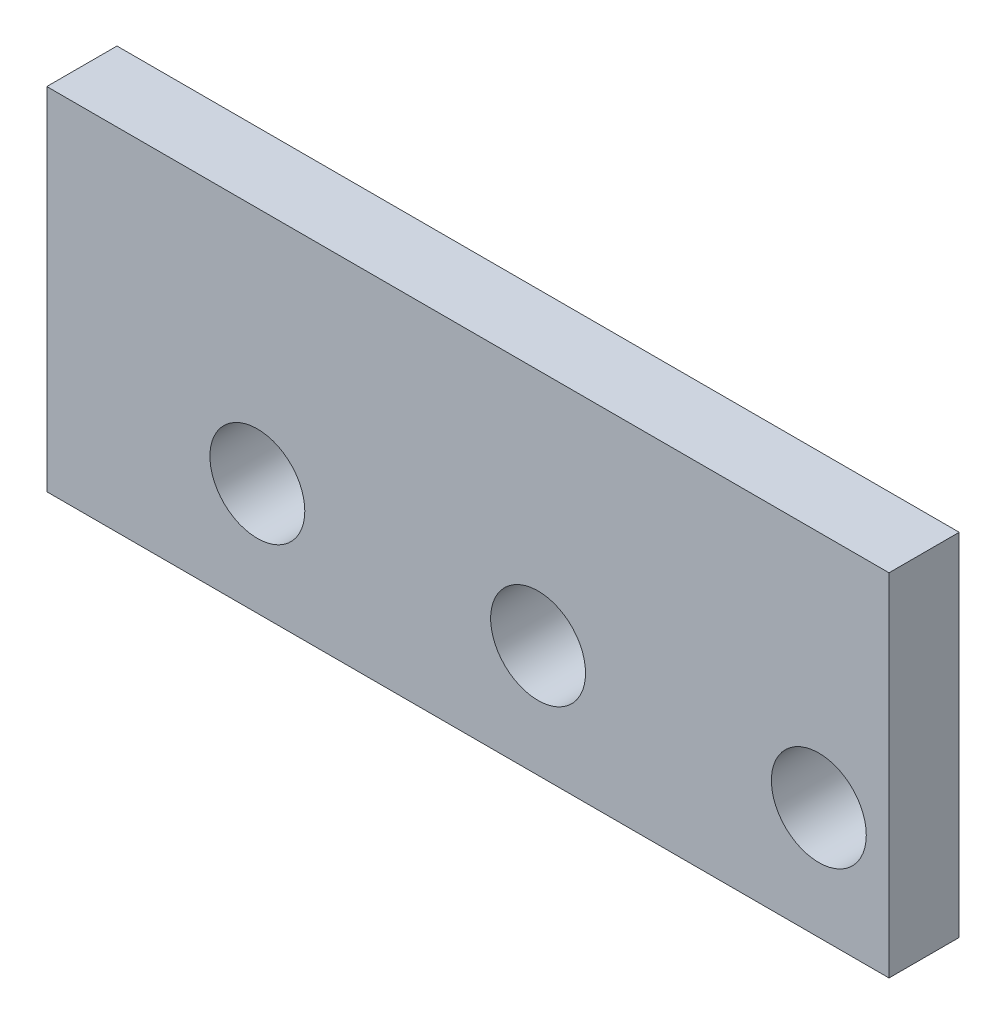
ISO-10303-21;
HEADER;
FILE_DESCRIPTION(('STEP AP214'),'2;1');
FILE_NAME('part.step','',(''),(''),'','','');
FILE_SCHEMA(('AUTOMOTIVE_DESIGN { 1 0 10303 214 1 1 1 1 }'));
ENDSEC;
DATA;
#1=APPLICATION_CONTEXT('core data for automotive mechanical design processes');
#2=APPLICATION_PROTOCOL_DEFINITION('international standard','automotive_design',2000,#1);
#3=PRODUCT_CONTEXT('',#1,'mechanical');
#4=PRODUCT('Part','Part','',(#3));
#5=PRODUCT_RELATED_PRODUCT_CATEGORY('part','',(#4));
#6=PRODUCT_DEFINITION_FORMATION('','',#4);
#7=PRODUCT_DEFINITION_CONTEXT('part definition',#1,'design');
#8=PRODUCT_DEFINITION('design','',#6,#7);
#9=PRODUCT_DEFINITION_SHAPE('','',#8);
#10=(LENGTH_UNIT() NAMED_UNIT(*) SI_UNIT(.MILLI.,.METRE.));
#11=(NAMED_UNIT(*) PLANE_ANGLE_UNIT() SI_UNIT($,.RADIAN.));
#12=(NAMED_UNIT(*) SI_UNIT($,.STERADIAN.) SOLID_ANGLE_UNIT());
#13=UNCERTAINTY_MEASURE_WITH_UNIT(LENGTH_MEASURE(1.E-05),#10,'distance_accuracy_value','');
#14=(GEOMETRIC_REPRESENTATION_CONTEXT(3) GLOBAL_UNCERTAINTY_ASSIGNED_CONTEXT((#13)) GLOBAL_UNIT_ASSIGNED_CONTEXT((#10,
#11,#12)) REPRESENTATION_CONTEXT('',''));
#15=CARTESIAN_POINT('',(0.,0.,0.));
#16=DIRECTION('',(0.,0.,1.));
#17=DIRECTION('',(1.,0.,0.));
#18=AXIS2_PLACEMENT_3D('',#15,#16,#17);
#19=CARTESIAN_POINT('',(0.,0.,3.175));
#20=DIRECTION('',(0.,0.,-1.));
#21=DIRECTION('',(-1.,0.,0.));
#22=AXIS2_PLACEMENT_3D('',#19,#20,#21);
#23=PLANE('',#22);
#24=DIRECTION('',(0.,-1.,0.));
#25=VECTOR('',#24,1.);
#26=CARTESIAN_POINT('',(0.,0.,3.175));
#27=LINE('',#26,#25);
#28=CARTESIAN_POINT('',(0.,15.875,3.175));
#29=VERTEX_POINT('',#28);
#30=CARTESIAN_POINT('',(0.,0.,3.175));
#31=VERTEX_POINT('',#30);
#32=EDGE_CURVE('E89',#29,#31,#27,.T.);
#33=ORIENTED_EDGE('',*,*,#32,.T.);
#34=DIRECTION('',(1.,0.,0.));
#35=VECTOR('',#34,1.);
#36=CARTESIAN_POINT('',(0.,0.,3.175));
#37=LINE('',#36,#35);
#38=CARTESIAN_POINT('',(38.1,0.,3.175));
#39=VERTEX_POINT('',#38);
#40=EDGE_CURVE('E84',#31,#39,#37,.T.);
#41=ORIENTED_EDGE('',*,*,#40,.T.);
#42=DIRECTION('',(0.,1.,0.));
#43=VECTOR('',#42,1.);
#44=CARTESIAN_POINT('',(38.1,0.,3.175));
#45=LINE('',#44,#43);
#46=CARTESIAN_POINT('',(38.1,15.875,3.175));
#47=VERTEX_POINT('',#46);
#48=EDGE_CURVE('E87',#39,#47,#45,.T.);
#49=ORIENTED_EDGE('',*,*,#48,.T.);
#50=DIRECTION('',(-1.,0.,0.));
#51=VECTOR('',#50,1.);
#52=CARTESIAN_POINT('',(0.,15.875,3.175));
#53=LINE('',#52,#51);
#54=EDGE_CURVE('E54',#47,#29,#53,.T.);
#55=ORIENTED_EDGE('',*,*,#54,.T.);
#56=EDGE_LOOP('',(#33,#41,#49,#55));
#57=FACE_BOUND('',#56,.T.);
#58=CARTESIAN_POINT('',(9.525,5.08,3.175));
#59=DIRECTION('',(0.,0.,1.));
#60=DIRECTION('',(1.,0.,0.));
#61=AXIS2_PLACEMENT_3D('',#58,#59,#60);
#62=CIRCLE('',#61,2.1463);
#63=CARTESIAN_POINT('',(11.6713,5.08,3.175));
#64=VERTEX_POINT('',#63);
#65=EDGE_CURVE('E104',#64,#64,#62,.T.);
#66=ORIENTED_EDGE('',*,*,#65,.F.);
#67=EDGE_LOOP('',(#66));
#68=FACE_BOUND('',#67,.T.);
#69=CARTESIAN_POINT('',(22.225,5.08,3.175));
#70=DIRECTION('',(0.,0.,1.));
#71=DIRECTION('',(1.,0.,0.));
#72=AXIS2_PLACEMENT_3D('',#69,#70,#71);
#73=CIRCLE('',#72,2.1463);
#74=CARTESIAN_POINT('',(24.3713,5.08,3.175));
#75=VERTEX_POINT('',#74);
#76=EDGE_CURVE('E119',#75,#75,#73,.T.);
#77=ORIENTED_EDGE('',*,*,#76,.F.);
#78=EDGE_LOOP('',(#77));
#79=FACE_BOUND('',#78,.T.);
#80=CARTESIAN_POINT('',(34.925,5.08,3.175));
#81=DIRECTION('',(0.,0.,1.));
#82=DIRECTION('',(1.,0.,0.));
#83=AXIS2_PLACEMENT_3D('',#80,#81,#82);
#84=CIRCLE('',#83,2.14630000000001);
#85=CARTESIAN_POINT('',(37.0713,5.08,3.175));
#86=VERTEX_POINT('',#85);
#87=EDGE_CURVE('E125',#86,#86,#84,.T.);
#88=ORIENTED_EDGE('',*,*,#87,.F.);
#89=EDGE_LOOP('',(#88));
#90=FACE_BOUND('',#89,.T.);
#91=ADVANCED_FACE('F37',(#57,#68,#79,#90),#23,.F.);
#92=CARTESIAN_POINT('',(0.,0.,0.));
#93=DIRECTION('',(0.,0.,-1.));
#94=DIRECTION('',(-1.,0.,0.));
#95=AXIS2_PLACEMENT_3D('',#92,#93,#94);
#96=PLANE('',#95);
#97=CARTESIAN_POINT('',(22.225,5.08,0.));
#98=DIRECTION('',(0.,0.,1.));
#99=DIRECTION('',(1.,0.,0.));
#100=AXIS2_PLACEMENT_3D('',#97,#98,#99);
#101=CIRCLE('',#100,2.1463);
#102=CARTESIAN_POINT('',(24.3713,5.08,0.));
#103=VERTEX_POINT('',#102);
#104=EDGE_CURVE('E122',#103,#103,#101,.T.);
#105=ORIENTED_EDGE('',*,*,#104,.T.);
#106=EDGE_LOOP('',(#105));
#107=FACE_BOUND('',#106,.T.);
#108=DIRECTION('',(0.,-1.,0.));
#109=VECTOR('',#108,1.);
#110=CARTESIAN_POINT('',(0.,0.,0.));
#111=LINE('',#110,#109);
#112=CARTESIAN_POINT('',(0.,15.875,0.));
#113=VERTEX_POINT('',#112);
#114=CARTESIAN_POINT('',(0.,0.,0.));
#115=VERTEX_POINT('',#114);
#116=EDGE_CURVE('E101',#113,#115,#111,.T.);
#117=ORIENTED_EDGE('',*,*,#116,.F.);
#118=DIRECTION('',(-1.,0.,0.));
#119=VECTOR('',#118,1.);
#120=CARTESIAN_POINT('',(0.,15.875,0.));
#121=LINE('',#120,#119);
#122=CARTESIAN_POINT('',(38.1,15.875,0.));
#123=VERTEX_POINT('',#122);
#124=EDGE_CURVE('E77',#123,#113,#121,.T.);
#125=ORIENTED_EDGE('',*,*,#124,.F.);
#126=DIRECTION('',(0.,1.,0.));
#127=VECTOR('',#126,1.);
#128=CARTESIAN_POINT('',(38.1,0.,0.));
#129=LINE('',#128,#127);
#130=CARTESIAN_POINT('',(38.1,0.,0.));
#131=VERTEX_POINT('',#130);
#132=EDGE_CURVE('E71',#131,#123,#129,.T.);
#133=ORIENTED_EDGE('',*,*,#132,.F.);
#134=DIRECTION('',(1.,0.,0.));
#135=VECTOR('',#134,1.);
#136=CARTESIAN_POINT('',(0.,0.,0.));
#137=LINE('',#136,#135);
#138=EDGE_CURVE('E93',#115,#131,#137,.T.);
#139=ORIENTED_EDGE('',*,*,#138,.F.);
#140=EDGE_LOOP('',(#117,#125,#133,#139));
#141=FACE_BOUND('',#140,.T.);
#142=CARTESIAN_POINT('',(9.525,5.08,0.));
#143=DIRECTION('',(0.,0.,1.));
#144=DIRECTION('',(1.,0.,0.));
#145=AXIS2_PLACEMENT_3D('',#142,#143,#144);
#146=CIRCLE('',#145,2.1463);
#147=CARTESIAN_POINT('',(11.6713,5.08,0.));
#148=VERTEX_POINT('',#147);
#149=EDGE_CURVE('E116',#148,#148,#146,.T.);
#150=ORIENTED_EDGE('',*,*,#149,.T.);
#151=EDGE_LOOP('',(#150));
#152=FACE_BOUND('',#151,.T.);
#153=CARTESIAN_POINT('',(34.925,5.08,0.));
#154=DIRECTION('',(0.,0.,1.));
#155=DIRECTION('',(1.,0.,0.));
#156=AXIS2_PLACEMENT_3D('',#153,#154,#155);
#157=CIRCLE('',#156,2.14630000000001);
#158=CARTESIAN_POINT('',(37.0713,5.08,0.));
#159=VERTEX_POINT('',#158);
#160=EDGE_CURVE('E128',#159,#159,#157,.T.);
#161=ORIENTED_EDGE('',*,*,#160,.T.);
#162=EDGE_LOOP('',(#161));
#163=FACE_BOUND('',#162,.T.);
#164=ADVANCED_FACE('F112',(#107,#141,#152,#163),#96,.T.);
#165=CARTESIAN_POINT('',(0.,0.,3.175));
#166=DIRECTION('',(1.,0.,0.));
#167=DIRECTION('',(0.,0.,-1.));
#168=AXIS2_PLACEMENT_3D('',#165,#166,#167);
#169=PLANE('',#168);
#170=ORIENTED_EDGE('',*,*,#116,.T.);
#171=DIRECTION('',(0.,0.,-1.));
#172=VECTOR('',#171,1.);
#173=CARTESIAN_POINT('',(0.,0.,3.175));
#174=LINE('',#173,#172);
#175=EDGE_CURVE('E11',#31,#115,#174,.T.);
#176=ORIENTED_EDGE('',*,*,#175,.F.);
#177=ORIENTED_EDGE('',*,*,#32,.F.);
#178=DIRECTION('',(0.,0.,-1.));
#179=VECTOR('',#178,1.);
#180=CARTESIAN_POINT('',(0.,15.875,3.175));
#181=LINE('',#180,#179);
#182=EDGE_CURVE('E97',#29,#113,#181,.T.);
#183=ORIENTED_EDGE('',*,*,#182,.T.);
#184=EDGE_LOOP('',(#170,#176,#177,#183));
#185=FACE_BOUND('',#184,.T.);
#186=ADVANCED_FACE('F39',(#185),#169,.F.);
#187=CARTESIAN_POINT('',(0.,0.,3.175));
#188=DIRECTION('',(0.,1.,0.));
#189=DIRECTION('',(0.,0.,1.));
#190=AXIS2_PLACEMENT_3D('',#187,#188,#189);
#191=PLANE('',#190);
#192=ORIENTED_EDGE('',*,*,#138,.T.);
#193=DIRECTION('',(0.,0.,-1.));
#194=VECTOR('',#193,1.);
#195=CARTESIAN_POINT('',(38.1,0.,3.175));
#196=LINE('',#195,#194);
#197=EDGE_CURVE('E46',#39,#131,#196,.T.);
#198=ORIENTED_EDGE('',*,*,#197,.F.);
#199=ORIENTED_EDGE('',*,*,#40,.F.);
#200=ORIENTED_EDGE('',*,*,#175,.T.);
#201=EDGE_LOOP('',(#192,#198,#199,#200));
#202=FACE_BOUND('',#201,.T.);
#203=ADVANCED_FACE('F92',(#202),#191,.F.);
#204=CARTESIAN_POINT('',(38.1,0.,3.175));
#205=DIRECTION('',(-1.,0.,0.));
#206=DIRECTION('',(0.,0.,1.));
#207=AXIS2_PLACEMENT_3D('',#204,#205,#206);
#208=PLANE('',#207);
#209=ORIENTED_EDGE('',*,*,#132,.T.);
#210=DIRECTION('',(0.,0.,-1.));
#211=VECTOR('',#210,1.);
#212=CARTESIAN_POINT('',(38.1,15.875,3.175));
#213=LINE('',#212,#211);
#214=EDGE_CURVE('E94',#47,#123,#213,.T.);
#215=ORIENTED_EDGE('',*,*,#214,.F.);
#216=ORIENTED_EDGE('',*,*,#48,.F.);
#217=ORIENTED_EDGE('',*,*,#197,.T.);
#218=EDGE_LOOP('',(#209,#215,#216,#217));
#219=FACE_BOUND('',#218,.T.);
#220=ADVANCED_FACE('F95',(#219),#208,.F.);
#221=CARTESIAN_POINT('',(0.,15.875,3.175));
#222=DIRECTION('',(0.,-1.,0.));
#223=DIRECTION('',(0.,0.,-1.));
#224=AXIS2_PLACEMENT_3D('',#221,#222,#223);
#225=PLANE('',#224);
#226=ORIENTED_EDGE('',*,*,#124,.T.);
#227=ORIENTED_EDGE('',*,*,#182,.F.);
#228=ORIENTED_EDGE('',*,*,#54,.F.);
#229=ORIENTED_EDGE('',*,*,#214,.T.);
#230=EDGE_LOOP('',(#226,#227,#228,#229));
#231=FACE_BOUND('',#230,.T.);
#232=ADVANCED_FACE('F109',(#231),#225,.F.);
#233=CARTESIAN_POINT('',(9.525,5.08,3.175));
#234=DIRECTION('',(0.,0.,-1.));
#235=DIRECTION('',(-1.,0.,0.));
#236=AXIS2_PLACEMENT_3D('',#233,#234,#235);
#237=CYLINDRICAL_SURFACE('',#236,2.1463);
#238=ORIENTED_EDGE('',*,*,#65,.T.);
#239=EDGE_LOOP('',(#238));
#240=FACE_BOUND('',#239,.T.);
#241=ORIENTED_EDGE('',*,*,#149,.F.);
#242=EDGE_LOOP('',(#241));
#243=FACE_BOUND('',#242,.T.);
#244=ADVANCED_FACE('F145',(#240,#243),#237,.F.);
#245=CARTESIAN_POINT('',(22.225,5.08,3.175));
#246=DIRECTION('',(0.,0.,-1.));
#247=DIRECTION('',(-1.,0.,0.));
#248=AXIS2_PLACEMENT_3D('',#245,#246,#247);
#249=CYLINDRICAL_SURFACE('',#248,2.1463);
#250=ORIENTED_EDGE('',*,*,#76,.T.);
#251=EDGE_LOOP('',(#250));
#252=FACE_BOUND('',#251,.T.);
#253=ORIENTED_EDGE('',*,*,#104,.F.);
#254=EDGE_LOOP('',(#253));
#255=FACE_BOUND('',#254,.T.);
#256=ADVANCED_FACE('F191',(#252,#255),#249,.F.);
#257=CARTESIAN_POINT('',(34.925,5.08,3.175));
#258=DIRECTION('',(0.,0.,-1.));
#259=DIRECTION('',(-1.,0.,0.));
#260=AXIS2_PLACEMENT_3D('',#257,#258,#259);
#261=CYLINDRICAL_SURFACE('',#260,2.14630000000001);
#262=ORIENTED_EDGE('',*,*,#87,.T.);
#263=EDGE_LOOP('',(#262));
#264=FACE_BOUND('',#263,.T.);
#265=ORIENTED_EDGE('',*,*,#160,.F.);
#266=EDGE_LOOP('',(#265));
#267=FACE_BOUND('',#266,.T.);
#268=ADVANCED_FACE('F134',(#264,#267),#261,.F.);
#269=CLOSED_SHELL('',(#91,#164,#186,#203,#220,#232,#244,#256,#268));
#270=MANIFOLD_SOLID_BREP('B2',#269);
#271=ADVANCED_BREP_SHAPE_REPRESENTATION('',(#18,#270),#14);
#272=SHAPE_DEFINITION_REPRESENTATION(#9,#271);
ENDSEC;
END-ISO-10303-21;
